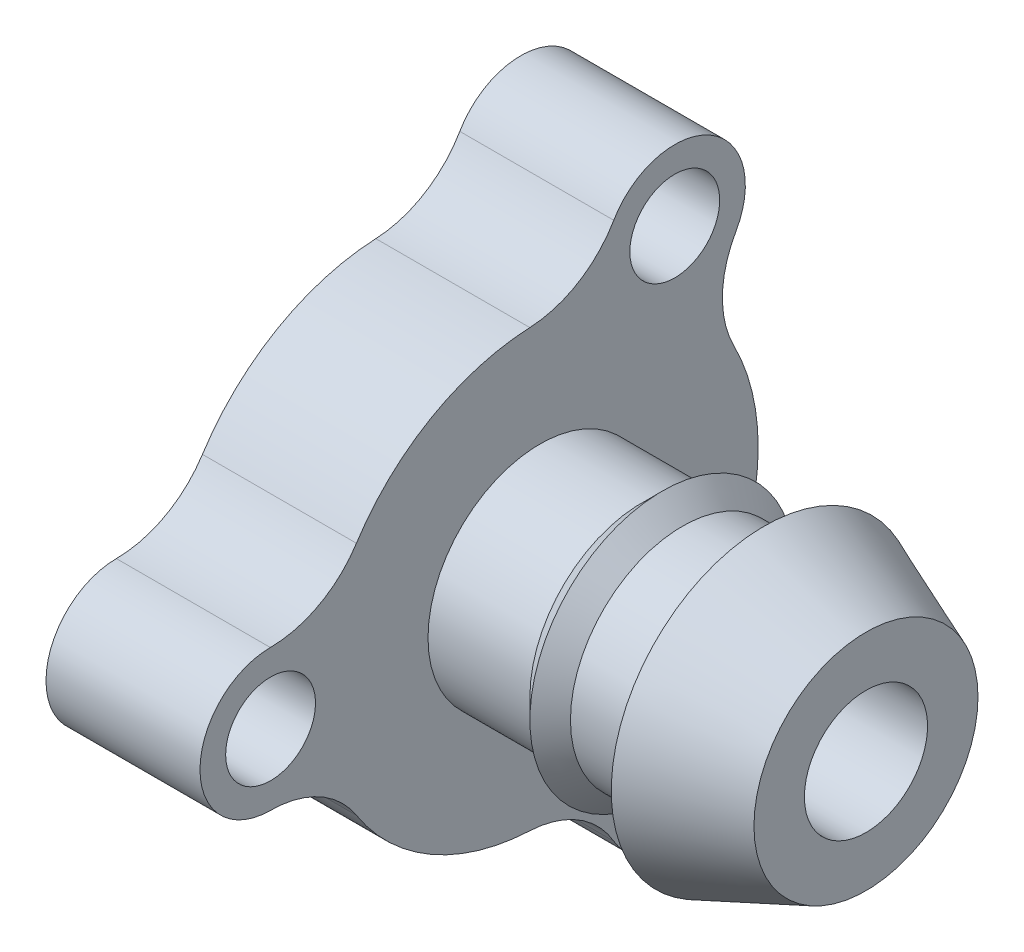
ISO-10303-21;
HEADER;
FILE_DESCRIPTION(('STEP AP214'),'2;1');
FILE_NAME('part.step','',(''),(''),'','','');
FILE_SCHEMA(('AUTOMOTIVE_DESIGN { 1 0 10303 214 1 1 1 1 }'));
ENDSEC;
DATA;
#1=APPLICATION_CONTEXT('core data for automotive mechanical design processes');
#2=APPLICATION_PROTOCOL_DEFINITION('international standard','automotive_design',2000,#1);
#3=PRODUCT_CONTEXT('',#1,'mechanical');
#4=PRODUCT('Part','Part','',(#3));
#5=PRODUCT_RELATED_PRODUCT_CATEGORY('part','',(#4));
#6=PRODUCT_DEFINITION_FORMATION('','',#4);
#7=PRODUCT_DEFINITION_CONTEXT('part definition',#1,'design');
#8=PRODUCT_DEFINITION('design','',#6,#7);
#9=PRODUCT_DEFINITION_SHAPE('','',#8);
#10=(LENGTH_UNIT() NAMED_UNIT(*) SI_UNIT(.MILLI.,.METRE.));
#11=(NAMED_UNIT(*) PLANE_ANGLE_UNIT() SI_UNIT($,.RADIAN.));
#12=(NAMED_UNIT(*) SI_UNIT($,.STERADIAN.) SOLID_ANGLE_UNIT());
#13=UNCERTAINTY_MEASURE_WITH_UNIT(LENGTH_MEASURE(1.E-05),#10,'distance_accuracy_value','');
#14=(GEOMETRIC_REPRESENTATION_CONTEXT(3) GLOBAL_UNCERTAINTY_ASSIGNED_CONTEXT((#13)) GLOBAL_UNIT_ASSIGNED_CONTEXT((#10,
#11,#12)) REPRESENTATION_CONTEXT('',''));
#15=CARTESIAN_POINT('',(0.,0.,0.));
#16=DIRECTION('',(0.,0.,1.));
#17=DIRECTION('',(1.,0.,0.));
#18=AXIS2_PLACEMENT_3D('',#15,#16,#17);
#19=CARTESIAN_POINT('',(-14.7,0.,0.));
#20=DIRECTION('',(1.,0.,0.));
#21=DIRECTION('',(0.,0.,-1.));
#22=AXIS2_PLACEMENT_3D('',#19,#20,#21);
#23=CYLINDRICAL_SURFACE('',#22,8.5);
#24=CARTESIAN_POINT('',(-12.7,0.,0.));
#25=DIRECTION('',(-1.,0.,0.));
#26=DIRECTION('',(0.,0.,1.));
#27=AXIS2_PLACEMENT_3D('',#24,#25,#26);
#28=CIRCLE('',#27,8.5);
#29=CARTESIAN_POINT('',(-12.7,3.90070100733716,-7.55212100349027));
#30=VERTEX_POINT('',#29);
#31=CARTESIAN_POINT('',(-12.7,-3.90070100733716,-7.55212100349027));
#32=VERTEX_POINT('',#31);
#33=EDGE_CURVE('E222',#30,#32,#28,.T.);
#34=ORIENTED_EDGE('',*,*,#33,.T.);
#35=DIRECTION('',(1.,0.,0.));
#36=VECTOR('',#35,1.);
#37=CARTESIAN_POINT('',(-14.7,-3.90070100733716,-7.55212100349027));
#38=LINE('',#37,#36);
#39=CARTESIAN_POINT('',(-18.7,-3.90070100733716,-7.55212100349027));
#40=VERTEX_POINT('',#39);
#41=EDGE_CURVE('E279',#32,#40,#38,.F.);
#42=ORIENTED_EDGE('',*,*,#41,.T.);
#43=CARTESIAN_POINT('',(-18.7,0.,0.));
#44=DIRECTION('',(-1.,0.,0.));
#45=DIRECTION('',(0.,0.,1.));
#46=AXIS2_PLACEMENT_3D('',#43,#44,#45);
#47=CIRCLE('',#46,8.5);
#48=CARTESIAN_POINT('',(-18.7,3.90070100733716,-7.55212100349027));
#49=VERTEX_POINT('',#48);
#50=EDGE_CURVE('E217',#49,#40,#47,.T.);
#51=ORIENTED_EDGE('',*,*,#50,.F.);
#52=DIRECTION('',(1.,0.,0.));
#53=VECTOR('',#52,1.);
#54=CARTESIAN_POINT('',(-14.7,3.90070100733716,-7.55212100349027));
#55=LINE('',#54,#53);
#56=EDGE_CURVE('E276',#49,#30,#55,.T.);
#57=ORIENTED_EDGE('',*,*,#56,.T.);
#58=EDGE_LOOP('',(#34,#42,#51,#57));
#59=FACE_BOUND('',#58,.T.);
#60=ADVANCED_FACE('F87',(#59),#23,.T.);
#61=CARTESIAN_POINT('',(-12.7,-8.49067914514518,0.397954336823604));
#62=VERTEX_POINT('',#61);
#63=CARTESIAN_POINT('',(-12.7,-4.58997813780802,7.15416666666667));
#64=VERTEX_POINT('',#63);
#65=EDGE_CURVE('E221',#62,#64,#28,.T.);
#66=ORIENTED_EDGE('',*,*,#65,.T.);
#67=DIRECTION('',(1.,0.,0.));
#68=VECTOR('',#67,1.);
#69=CARTESIAN_POINT('',(-14.7,-4.58997813780802,7.15416666666667));
#70=LINE('',#69,#68);
#71=CARTESIAN_POINT('',(-18.7,-4.58997813780802,7.15416666666667));
#72=VERTEX_POINT('',#71);
#73=EDGE_CURVE('E258',#64,#72,#70,.F.);
#74=ORIENTED_EDGE('',*,*,#73,.T.);
#75=CARTESIAN_POINT('',(-18.7,-8.49067914514518,0.397954336823605));
#76=VERTEX_POINT('',#75);
#77=EDGE_CURVE('E216',#76,#72,#47,.T.);
#78=ORIENTED_EDGE('',*,*,#77,.F.);
#79=DIRECTION('',(1.,0.,0.));
#80=VECTOR('',#79,1.);
#81=CARTESIAN_POINT('',(-14.7,-8.49067914514518,0.397954336823605));
#82=LINE('',#81,#80);
#83=EDGE_CURVE('E255',#76,#62,#82,.T.);
#84=ORIENTED_EDGE('',*,*,#83,.T.);
#85=EDGE_LOOP('',(#66,#74,#78,#84));
#86=FACE_BOUND('',#85,.T.);
#87=ADVANCED_FACE('F347',(#86),#23,.T.);
#88=CARTESIAN_POINT('',(-18.7,0.,0.));
#89=DIRECTION('',(-1.,0.,0.));
#90=DIRECTION('',(0.,0.,1.));
#91=AXIS2_PLACEMENT_3D('',#88,#89,#90);
#92=PLANE('',#91);
#93=CARTESIAN_POINT('',(-18.7,0.,10.5));
#94=DIRECTION('',(-1.,0.,0.));
#95=DIRECTION('',(0.,0.,1.));
#96=AXIS2_PLACEMENT_3D('',#93,#94,#95);
#97=CIRCLE('',#96,2.75);
#98=CARTESIAN_POINT('',(-18.7,-2.74998690173683,10.508487654321));
#99=VERTEX_POINT('',#98);
#100=CARTESIAN_POINT('',(-18.7,2.74998690173683,10.508487654321));
#101=VERTEX_POINT('',#100);
#102=EDGE_CURVE('E423',#99,#101,#97,.T.);
#103=ORIENTED_EDGE('',*,*,#102,.T.);
#104=CARTESIAN_POINT('',(-18.7,6.74996784971767,10.5208333333333));
#105=DIRECTION('',(-1.,0.,0.));
#106=DIRECTION('',(0.,0.,1.));
#107=AXIS2_PLACEMENT_3D('',#104,#105,#106);
#108=CIRCLE('',#107,4.);
#109=CARTESIAN_POINT('',(-18.7,4.58997813780802,7.15416666666667));
#110=VERTEX_POINT('',#109);
#111=EDGE_CURVE('E325',#101,#110,#108,.F.);
#112=ORIENTED_EDGE('',*,*,#111,.T.);
#113=CARTESIAN_POINT('',(-18.7,8.49067914514518,0.397954336823602));
#114=VERTEX_POINT('',#113);
#115=EDGE_CURVE('E209',#110,#114,#47,.T.);
#116=ORIENTED_EDGE('',*,*,#115,.T.);
#117=CARTESIAN_POINT('',(-18.7,12.4862928605076,0.58522696591706));
#118=DIRECTION('',(-1.,0.,0.));
#119=DIRECTION('',(0.,0.,1.));
#120=AXIS2_PLACEMENT_3D('',#117,#118,#119);
#121=CIRCLE('',#120,4.);
#122=CARTESIAN_POINT('',(-18.7,10.4756107148655,-2.87268531018194));
#123=VERTEX_POINT('',#122);
#124=EDGE_CURVE('E320',#114,#123,#121,.F.);
#125=ORIENTED_EDGE('',*,*,#124,.T.);
#126=CARTESIAN_POINT('',(-18.7,9.0932667397366,-5.25));
#127=DIRECTION('',(-1.,0.,0.));
#128=DIRECTION('',(0.,0.,1.));
#129=AXIS2_PLACEMENT_3D('',#126,#127,#128);
#130=CIRCLE('',#129,2.75);
#131=CARTESIAN_POINT('',(-18.7,7.72562381312871,-7.63580234413905));
#132=VERTEX_POINT('',#131);
#133=EDGE_CURVE('E201',#123,#132,#130,.T.);
#134=ORIENTED_EDGE('',*,*,#133,.T.);
#135=CARTESIAN_POINT('',(-18.7,5.73632501078994,-11.1060602992504));
#136=DIRECTION('',(-1.,0.,0.));
#137=DIRECTION('',(0.,0.,1.));
#138=AXIS2_PLACEMENT_3D('',#135,#136,#137);
#139=CIRCLE('',#138,4.);
#140=EDGE_CURVE('E314',#132,#49,#139,.F.);
#141=ORIENTED_EDGE('',*,*,#140,.T.);
#142=ORIENTED_EDGE('',*,*,#50,.T.);
#143=CARTESIAN_POINT('',(-18.7,-5.73632501078995,-11.1060602992504));
#144=DIRECTION('',(-1.,0.,0.));
#145=DIRECTION('',(0.,0.,1.));
#146=AXIS2_PLACEMENT_3D('',#143,#144,#145);
#147=CIRCLE('',#146,4.);
#148=CARTESIAN_POINT('',(-18.7,-7.72562381312871,-7.63580234413905));
#149=VERTEX_POINT('',#148);
#150=EDGE_CURVE('E308',#40,#149,#147,.F.);
#151=ORIENTED_EDGE('',*,*,#150,.T.);
#152=CARTESIAN_POINT('',(-18.7,-9.09326673973661,-5.25));
#153=DIRECTION('',(-1.,0.,0.));
#154=DIRECTION('',(0.,0.,1.));
#155=AXIS2_PLACEMENT_3D('',#152,#153,#154);
#156=CIRCLE('',#155,2.75);
#157=CARTESIAN_POINT('',(-18.7,-10.4756107148655,-2.87268531018193));
#158=VERTEX_POINT('',#157);
#159=EDGE_CURVE('E419',#149,#158,#156,.T.);
#160=ORIENTED_EDGE('',*,*,#159,.T.);
#161=CARTESIAN_POINT('',(-18.7,-12.4862928605076,0.585226965917065));
#162=DIRECTION('',(-1.,0.,0.));
#163=DIRECTION('',(0.,0.,1.));
#164=AXIS2_PLACEMENT_3D('',#161,#162,#163);
#165=CIRCLE('',#164,4.);
#166=EDGE_CURVE('E302',#158,#76,#165,.F.);
#167=ORIENTED_EDGE('',*,*,#166,.T.);
#168=ORIENTED_EDGE('',*,*,#77,.T.);
#169=CARTESIAN_POINT('',(-18.7,-6.74996784971767,10.5208333333333));
#170=DIRECTION('',(-1.,0.,0.));
#171=DIRECTION('',(0.,0.,1.));
#172=AXIS2_PLACEMENT_3D('',#169,#170,#171);
#173=CIRCLE('',#172,4.);
#174=EDGE_CURVE('E296',#72,#99,#173,.F.);
#175=ORIENTED_EDGE('',*,*,#174,.T.);
#176=EDGE_LOOP('',(#103,#112,#116,#125,#134,#141,#142,#151,#160,#167,#168,#175));
#177=FACE_BOUND('',#176,.T.);
#178=CARTESIAN_POINT('',(-18.7,0.,0.));
#179=DIRECTION('',(-1.,0.,0.));
#180=DIRECTION('',(0.,0.,1.));
#181=AXIS2_PLACEMENT_3D('',#178,#179,#180);
#182=CIRCLE('',#181,6.97135130214869);
#183=CARTESIAN_POINT('',(-18.7,0.,6.97135130214869));
#184=VERTEX_POINT('',#183);
#185=EDGE_CURVE('E191',#184,#184,#182,.T.);
#186=ORIENTED_EDGE('',*,*,#185,.F.);
#187=EDGE_LOOP('',(#186));
#188=FACE_BOUND('',#187,.T.);
#189=CARTESIAN_POINT('',(-18.7,0.,10.5));
#190=DIRECTION('',(-1.,0.,0.));
#191=DIRECTION('',(0.,0.,1.));
#192=AXIS2_PLACEMENT_3D('',#189,#190,#191);
#193=CIRCLE('',#192,1.75);
#194=CARTESIAN_POINT('',(-18.7,0.,12.25));
#195=VERTEX_POINT('',#194);
#196=EDGE_CURVE('E418',#195,#195,#193,.T.);
#197=ORIENTED_EDGE('',*,*,#196,.F.);
#198=EDGE_LOOP('',(#197));
#199=FACE_BOUND('',#198,.T.);
#200=CARTESIAN_POINT('',(-18.7,-9.09326673973661,-5.25));
#201=DIRECTION('',(-1.,0.,0.));
#202=DIRECTION('',(0.,0.,1.));
#203=AXIS2_PLACEMENT_3D('',#200,#201,#202);
#204=CIRCLE('',#203,1.75);
#205=CARTESIAN_POINT('',(-18.7,-9.09326673973661,-3.5));
#206=VERTEX_POINT('',#205);
#207=EDGE_CURVE('E406',#206,#206,#204,.T.);
#208=ORIENTED_EDGE('',*,*,#207,.F.);
#209=EDGE_LOOP('',(#208));
#210=FACE_BOUND('',#209,.T.);
#211=CARTESIAN_POINT('',(-18.7,9.0932667397366,-5.25));
#212=DIRECTION('',(-1.,0.,0.));
#213=DIRECTION('',(0.,0.,1.));
#214=AXIS2_PLACEMENT_3D('',#211,#212,#213);
#215=CIRCLE('',#214,1.75);
#216=CARTESIAN_POINT('',(-18.7,9.0932667397366,-3.5));
#217=VERTEX_POINT('',#216);
#218=EDGE_CURVE('E386',#217,#217,#215,.T.);
#219=ORIENTED_EDGE('',*,*,#218,.F.);
#220=EDGE_LOOP('',(#219));
#221=FACE_BOUND('',#220,.T.);
#222=ADVANCED_FACE('F355',(#177,#188,#199,#210,#221),#92,.T.);
#223=CARTESIAN_POINT('',(-18.7,0.,0.));
#224=DIRECTION('',(-1.,0.,0.));
#225=DIRECTION('',(0.,0.,1.));
#226=AXIS2_PLACEMENT_3D('',#223,#224,#225);
#227=CIRCLE('',#226,4.365);
#228=CARTESIAN_POINT('',(-18.7,0.,4.365));
#229=VERTEX_POINT('',#228);
#230=EDGE_CURVE('E205',#229,#229,#227,.T.);
#231=ORIENTED_EDGE('',*,*,#230,.F.);
#232=EDGE_LOOP('',(#231));
#233=FACE_BOUND('',#232,.T.);
#234=CARTESIAN_POINT('',(-18.7,0.,0.));
#235=DIRECTION('',(1.,0.,0.));
#236=DIRECTION('',(0.,0.,-1.));
#237=AXIS2_PLACEMENT_3D('',#234,#235,#236);
#238=CIRCLE('',#237,5.19335130214869);
#239=CARTESIAN_POINT('',(-18.7,0.,5.19335130214869));
#240=VERTEX_POINT('',#239);
#241=EDGE_CURVE('E189',#240,#240,#238,.T.);
#242=ORIENTED_EDGE('',*,*,#241,.F.);
#243=EDGE_LOOP('',(#242));
#244=FACE_BOUND('',#243,.T.);
#245=ADVANCED_FACE('F444',(#233,#244),#92,.T.);
#246=CARTESIAN_POINT('',(0.,0.,0.));
#247=DIRECTION('',(1.,0.,0.));
#248=DIRECTION('',(0.,0.,-1.));
#249=AXIS2_PLACEMENT_3D('',#246,#247,#248);
#250=PLANE('',#249);
#251=CARTESIAN_POINT('',(0.,0.,0.));
#252=DIRECTION('',(-1.,0.,0.));
#253=DIRECTION('',(0.,0.,1.));
#254=AXIS2_PLACEMENT_3D('',#251,#252,#253);
#255=CIRCLE('',#254,2.4);
#256=CARTESIAN_POINT('',(0.,0.,2.4));
#257=VERTEX_POINT('',#256);
#258=EDGE_CURVE('E193',#257,#257,#255,.T.);
#259=ORIENTED_EDGE('',*,*,#258,.T.);
#260=EDGE_LOOP('',(#259));
#261=FACE_BOUND('',#260,.T.);
#262=CARTESIAN_POINT('',(0.,0.,0.));
#263=DIRECTION('',(1.,0.,0.));
#264=DIRECTION('',(0.,0.,-1.));
#265=AXIS2_PLACEMENT_3D('',#262,#263,#264);
#266=CIRCLE('',#265,4.365);
#267=CARTESIAN_POINT('',(0.,0.,-4.365));
#268=VERTEX_POINT('',#267);
#269=EDGE_CURVE('E247',#268,#268,#266,.T.);
#270=ORIENTED_EDGE('',*,*,#269,.T.);
#271=EDGE_LOOP('',(#270));
#272=FACE_BOUND('',#271,.T.);
#273=ADVANCED_FACE('F622',(#261,#272),#250,.T.);
#274=CARTESIAN_POINT('',(0.,0.,0.));
#275=DIRECTION('',(-1.,0.,0.));
#276=DIRECTION('',(0.,0.,1.));
#277=AXIS2_PLACEMENT_3D('',#274,#275,#276);
#278=CONICAL_SURFACE('',#277,4.365,0.380940593324763);
#279=CARTESIAN_POINT('',(-3.97,0.,0.));
#280=DIRECTION('',(1.,0.,0.));
#281=DIRECTION('',(0.,0.,-1.));
#282=AXIS2_PLACEMENT_3D('',#279,#280,#281);
#283=CIRCLE('',#282,5.955);
#284=CARTESIAN_POINT('',(-3.97,0.,-5.955));
#285=VERTEX_POINT('',#284);
#286=EDGE_CURVE('E243',#285,#285,#283,.T.);
#287=ORIENTED_EDGE('',*,*,#286,.T.);
#288=EDGE_LOOP('',(#287));
#289=FACE_BOUND('',#288,.T.);
#290=ORIENTED_EDGE('',*,*,#269,.F.);
#291=EDGE_LOOP('',(#290));
#292=FACE_BOUND('',#291,.T.);
#293=ADVANCED_FACE('F624',(#289,#292),#278,.T.);
#294=CARTESIAN_POINT('',(-3.97,0.,-5.955));
#295=DIRECTION('',(-1.,0.,0.));
#296=DIRECTION('',(0.,0.,1.));
#297=AXIS2_PLACEMENT_3D('',#294,#295,#296);
#298=PLANE('',#297);
#299=CARTESIAN_POINT('',(-3.97,0.,0.));
#300=DIRECTION('',(1.,0.,0.));
#301=DIRECTION('',(0.,0.,-1.));
#302=AXIS2_PLACEMENT_3D('',#299,#300,#301);
#303=CIRCLE('',#302,4.365);
#304=CARTESIAN_POINT('',(-3.97,0.,-4.365));
#305=VERTEX_POINT('',#304);
#306=EDGE_CURVE('E239',#305,#305,#303,.T.);
#307=ORIENTED_EDGE('',*,*,#306,.T.);
#308=EDGE_LOOP('',(#307));
#309=FACE_BOUND('',#308,.T.);
#310=ORIENTED_EDGE('',*,*,#286,.F.);
#311=EDGE_LOOP('',(#310));
#312=FACE_BOUND('',#311,.T.);
#313=ADVANCED_FACE('F628',(#309,#312),#298,.T.);
#314=CARTESIAN_POINT('',(0.,0.,0.));
#315=DIRECTION('',(1.,0.,0.));
#316=DIRECTION('',(0.,0.,-1.));
#317=AXIS2_PLACEMENT_3D('',#314,#315,#316);
#318=CYLINDRICAL_SURFACE('',#317,4.365);
#319=CARTESIAN_POINT('',(-7.15,0.,0.));
#320=DIRECTION('',(1.,0.,0.));
#321=DIRECTION('',(0.,0.,-1.));
#322=AXIS2_PLACEMENT_3D('',#319,#320,#321);
#323=CIRCLE('',#322,4.365);
#324=CARTESIAN_POINT('',(-7.15,0.,-4.365));
#325=VERTEX_POINT('',#324);
#326=EDGE_CURVE('E235',#325,#325,#323,.T.);
#327=ORIENTED_EDGE('',*,*,#326,.T.);
#328=EDGE_LOOP('',(#327));
#329=FACE_BOUND('',#328,.T.);
#330=ORIENTED_EDGE('',*,*,#306,.F.);
#331=EDGE_LOOP('',(#330));
#332=FACE_BOUND('',#331,.T.);
#333=ADVANCED_FACE('F632',(#329,#332),#318,.T.);
#334=CARTESIAN_POINT('',(-7.15,0.,0.));
#335=DIRECTION('',(-1.,0.,0.));
#336=DIRECTION('',(0.,0.,1.));
#337=AXIS2_PLACEMENT_3D('',#334,#335,#336);
#338=CONICAL_SURFACE('',#337,4.365,0.785398163397448);
#339=CARTESIAN_POINT('',(-7.94,0.,0.));
#340=DIRECTION('',(1.,0.,0.));
#341=DIRECTION('',(0.,0.,-1.));
#342=AXIS2_PLACEMENT_3D('',#339,#340,#341);
#343=CIRCLE('',#342,5.155);
#344=CARTESIAN_POINT('',(-7.94,0.,-5.155));
#345=VERTEX_POINT('',#344);
#346=EDGE_CURVE('E231',#345,#345,#343,.T.);
#347=ORIENTED_EDGE('',*,*,#346,.T.);
#348=EDGE_LOOP('',(#347));
#349=FACE_BOUND('',#348,.T.);
#350=ORIENTED_EDGE('',*,*,#326,.F.);
#351=EDGE_LOOP('',(#350));
#352=FACE_BOUND('',#351,.T.);
#353=ADVANCED_FACE('F636',(#349,#352),#338,.T.);
#354=CARTESIAN_POINT('',(-7.94,0.,0.));
#355=DIRECTION('',(1.,0.,0.));
#356=DIRECTION('',(0.,0.,-1.));
#357=AXIS2_PLACEMENT_3D('',#354,#355,#356);
#358=CONICAL_SURFACE('',#357,5.155,0.785398163397449);
#359=CARTESIAN_POINT('',(-8.73,0.,0.));
#360=DIRECTION('',(1.,0.,0.));
#361=DIRECTION('',(0.,0.,-1.));
#362=AXIS2_PLACEMENT_3D('',#359,#360,#361);
#363=CIRCLE('',#362,4.365);
#364=CARTESIAN_POINT('',(-8.73,0.,-4.365));
#365=VERTEX_POINT('',#364);
#366=EDGE_CURVE('E227',#365,#365,#363,.T.);
#367=ORIENTED_EDGE('',*,*,#366,.T.);
#368=EDGE_LOOP('',(#367));
#369=FACE_BOUND('',#368,.T.);
#370=ORIENTED_EDGE('',*,*,#346,.F.);
#371=EDGE_LOOP('',(#370));
#372=FACE_BOUND('',#371,.T.);
#373=ADVANCED_FACE('F370',(#369,#372),#358,.T.);
#374=CARTESIAN_POINT('',(0.,0.,0.));
#375=DIRECTION('',(1.,0.,0.));
#376=DIRECTION('',(0.,0.,-1.));
#377=AXIS2_PLACEMENT_3D('',#374,#375,#376);
#378=CYLINDRICAL_SURFACE('',#377,4.365);
#379=CARTESIAN_POINT('',(-12.7,0.,0.));
#380=DIRECTION('',(-1.,0.,0.));
#381=DIRECTION('',(0.,0.,1.));
#382=AXIS2_PLACEMENT_3D('',#379,#380,#381);
#383=CIRCLE('',#382,4.365);
#384=CARTESIAN_POINT('',(-12.7,0.,4.365));
#385=VERTEX_POINT('',#384);
#386=EDGE_CURVE('E223',#385,#385,#383,.F.);
#387=ORIENTED_EDGE('',*,*,#386,.T.);
#388=EDGE_LOOP('',(#387));
#389=FACE_BOUND('',#388,.T.);
#390=ORIENTED_EDGE('',*,*,#366,.F.);
#391=EDGE_LOOP('',(#390));
#392=FACE_BOUND('',#391,.T.);
#393=ADVANCED_FACE('F362',(#389,#392),#378,.T.);
#394=CARTESIAN_POINT('',(-12.7,4.58997813780802,7.15416666666667));
#395=VERTEX_POINT('',#394);
#396=CARTESIAN_POINT('',(-12.7,8.49067914514518,0.397954336823601));
#397=VERTEX_POINT('',#396);
#398=EDGE_CURVE('E218',#395,#397,#28,.T.);
#399=ORIENTED_EDGE('',*,*,#398,.T.);
#400=DIRECTION('',(1.,0.,0.));
#401=VECTOR('',#400,1.);
#402=CARTESIAN_POINT('',(-14.7,8.49067914514518,0.397954336823601));
#403=LINE('',#402,#401);
#404=EDGE_CURVE('E292',#397,#114,#403,.F.);
#405=ORIENTED_EDGE('',*,*,#404,.T.);
#406=ORIENTED_EDGE('',*,*,#115,.F.);
#407=DIRECTION('',(1.,0.,0.));
#408=VECTOR('',#407,1.);
#409=CARTESIAN_POINT('',(-14.7,4.58997813780802,7.15416666666667));
#410=LINE('',#409,#408);
#411=EDGE_CURVE('E111',#110,#395,#410,.T.);
#412=ORIENTED_EDGE('',*,*,#411,.T.);
#413=EDGE_LOOP('',(#399,#405,#406,#412));
#414=FACE_BOUND('',#413,.T.);
#415=ADVANCED_FACE('F350',(#414),#23,.T.);
#416=CARTESIAN_POINT('',(-12.7,0.,0.));
#417=DIRECTION('',(-1.,0.,0.));
#418=DIRECTION('',(0.,0.,1.));
#419=AXIS2_PLACEMENT_3D('',#416,#417,#418);
#420=PLANE('',#419);
#421=ORIENTED_EDGE('',*,*,#386,.F.);
#422=EDGE_LOOP('',(#421));
#423=FACE_BOUND('',#422,.T.);
#424=CARTESIAN_POINT('',(-12.7,9.0932667397366,-5.25));
#425=DIRECTION('',(-1.,0.,0.));
#426=DIRECTION('',(0.,0.,1.));
#427=AXIS2_PLACEMENT_3D('',#424,#425,#426);
#428=CIRCLE('',#427,1.75);
#429=CARTESIAN_POINT('',(-12.7,9.0932667397366,-3.5));
#430=VERTEX_POINT('',#429);
#431=EDGE_CURVE('E390',#430,#430,#428,.F.);
#432=ORIENTED_EDGE('',*,*,#431,.F.);
#433=EDGE_LOOP('',(#432));
#434=FACE_BOUND('',#433,.T.);
#435=ORIENTED_EDGE('',*,*,#33,.F.);
#436=CARTESIAN_POINT('',(-12.7,5.73632501078994,-11.1060602992504));
#437=DIRECTION('',(-1.,0.,0.));
#438=DIRECTION('',(0.,0.,1.));
#439=AXIS2_PLACEMENT_3D('',#436,#437,#438);
#440=CIRCLE('',#439,4.);
#441=CARTESIAN_POINT('',(-12.7,7.72562381312871,-7.63580234413905));
#442=VERTEX_POINT('',#441);
#443=EDGE_CURVE('E317',#30,#442,#440,.T.);
#444=ORIENTED_EDGE('',*,*,#443,.T.);
#445=CARTESIAN_POINT('',(-12.7,9.0932667397366,-5.25));
#446=DIRECTION('',(-1.,0.,0.));
#447=DIRECTION('',(0.,0.,1.));
#448=AXIS2_PLACEMENT_3D('',#445,#446,#447);
#449=CIRCLE('',#448,2.75);
#450=CARTESIAN_POINT('',(-12.7,10.4756107148655,-2.87268531018194));
#451=VERTEX_POINT('',#450);
#452=EDGE_CURVE('E194',#442,#451,#449,.F.);
#453=ORIENTED_EDGE('',*,*,#452,.T.);
#454=CARTESIAN_POINT('',(-12.7,12.4862928605076,0.58522696591706));
#455=DIRECTION('',(-1.,0.,0.));
#456=DIRECTION('',(0.,0.,1.));
#457=AXIS2_PLACEMENT_3D('',#454,#455,#456);
#458=CIRCLE('',#457,4.);
#459=EDGE_CURVE('E104',#451,#397,#458,.T.);
#460=ORIENTED_EDGE('',*,*,#459,.T.);
#461=ORIENTED_EDGE('',*,*,#398,.F.);
#462=CARTESIAN_POINT('',(-12.7,6.74996784971767,10.5208333333333));
#463=DIRECTION('',(-1.,0.,0.));
#464=DIRECTION('',(0.,0.,1.));
#465=AXIS2_PLACEMENT_3D('',#462,#463,#464);
#466=CIRCLE('',#465,4.);
#467=CARTESIAN_POINT('',(-12.7,2.74998690173683,10.508487654321));
#468=VERTEX_POINT('',#467);
#469=EDGE_CURVE('E328',#395,#468,#466,.T.);
#470=ORIENTED_EDGE('',*,*,#469,.T.);
#471=CARTESIAN_POINT('',(-12.7,0.,10.5));
#472=DIRECTION('',(-1.,0.,0.));
#473=DIRECTION('',(0.,0.,1.));
#474=AXIS2_PLACEMENT_3D('',#471,#472,#473);
#475=CIRCLE('',#474,2.75);
#476=CARTESIAN_POINT('',(-12.7,-2.74998690173683,10.508487654321));
#477=VERTEX_POINT('',#476);
#478=EDGE_CURVE('E401',#468,#477,#475,.F.);
#479=ORIENTED_EDGE('',*,*,#478,.T.);
#480=CARTESIAN_POINT('',(-12.7,-6.74996784971767,10.5208333333333));
#481=DIRECTION('',(-1.,0.,0.));
#482=DIRECTION('',(0.,0.,1.));
#483=AXIS2_PLACEMENT_3D('',#480,#481,#482);
#484=CIRCLE('',#483,4.);
#485=EDGE_CURVE('E299',#477,#64,#484,.T.);
#486=ORIENTED_EDGE('',*,*,#485,.T.);
#487=ORIENTED_EDGE('',*,*,#65,.F.);
#488=CARTESIAN_POINT('',(-12.7,-12.4862928605076,0.585226965917064));
#489=DIRECTION('',(-1.,0.,0.));
#490=DIRECTION('',(0.,0.,1.));
#491=AXIS2_PLACEMENT_3D('',#488,#489,#490);
#492=CIRCLE('',#491,4.);
#493=CARTESIAN_POINT('',(-12.7,-10.4756107148655,-2.87268531018194));
#494=VERTEX_POINT('',#493);
#495=EDGE_CURVE('E305',#62,#494,#492,.T.);
#496=ORIENTED_EDGE('',*,*,#495,.T.);
#497=CARTESIAN_POINT('',(-12.7,-9.09326673973661,-5.25));
#498=DIRECTION('',(-1.,0.,0.));
#499=DIRECTION('',(0.,0.,1.));
#500=AXIS2_PLACEMENT_3D('',#497,#498,#499);
#501=CIRCLE('',#500,2.75);
#502=CARTESIAN_POINT('',(-12.7,-7.72562381312871,-7.63580234413905));
#503=VERTEX_POINT('',#502);
#504=EDGE_CURVE('E393',#494,#503,#501,.F.);
#505=ORIENTED_EDGE('',*,*,#504,.T.);
#506=CARTESIAN_POINT('',(-12.7,-5.73632501078995,-11.1060602992504));
#507=DIRECTION('',(-1.,0.,0.));
#508=DIRECTION('',(0.,0.,1.));
#509=AXIS2_PLACEMENT_3D('',#506,#507,#508);
#510=CIRCLE('',#509,4.);
#511=EDGE_CURVE('E311',#503,#32,#510,.T.);
#512=ORIENTED_EDGE('',*,*,#511,.T.);
#513=EDGE_LOOP('',(#435,#444,#453,#460,#461,#470,#479,#486,#487,#496,#505,#512));
#514=FACE_BOUND('',#513,.T.);
#515=CARTESIAN_POINT('',(-12.7,0.,10.5));
#516=DIRECTION('',(-1.,0.,0.));
#517=DIRECTION('',(0.,0.,1.));
#518=AXIS2_PLACEMENT_3D('',#515,#516,#517);
#519=CIRCLE('',#518,1.75);
#520=CARTESIAN_POINT('',(-12.7,0.,12.25));
#521=VERTEX_POINT('',#520);
#522=EDGE_CURVE('E414',#521,#521,#519,.F.);
#523=ORIENTED_EDGE('',*,*,#522,.F.);
#524=EDGE_LOOP('',(#523));
#525=FACE_BOUND('',#524,.T.);
#526=CARTESIAN_POINT('',(-12.7,-9.09326673973661,-5.25));
#527=DIRECTION('',(-1.,0.,0.));
#528=DIRECTION('',(0.,0.,1.));
#529=AXIS2_PLACEMENT_3D('',#526,#527,#528);
#530=CIRCLE('',#529,1.75);
#531=CARTESIAN_POINT('',(-12.7,-9.09326673973661,-3.5));
#532=VERTEX_POINT('',#531);
#533=EDGE_CURVE('E411',#532,#532,#530,.F.);
#534=ORIENTED_EDGE('',*,*,#533,.F.);
#535=EDGE_LOOP('',(#534));
#536=FACE_BOUND('',#535,.T.);
#537=ADVANCED_FACE('F361',(#423,#434,#514,#525,#536),#420,.F.);
#538=CARTESIAN_POINT('',(-18.7,0.,0.));
#539=DIRECTION('',(1.,0.,0.));
#540=DIRECTION('',(0.,0.,-1.));
#541=AXIS2_PLACEMENT_3D('',#538,#539,#540);
#542=CYLINDRICAL_SURFACE('',#541,4.365);
#543=ORIENTED_EDGE('',*,*,#230,.T.);
#544=EDGE_LOOP('',(#543));
#545=FACE_BOUND('',#544,.T.);
#546=CARTESIAN_POINT('',(-14.7,0.,0.));
#547=DIRECTION('',(-1.,0.,0.));
#548=DIRECTION('',(0.,0.,1.));
#549=AXIS2_PLACEMENT_3D('',#546,#547,#548);
#550=CIRCLE('',#549,4.365);
#551=CARTESIAN_POINT('',(-14.7,0.,4.365));
#552=VERTEX_POINT('',#551);
#553=EDGE_CURVE('E199',#552,#552,#550,.T.);
#554=ORIENTED_EDGE('',*,*,#553,.F.);
#555=EDGE_LOOP('',(#554));
#556=FACE_BOUND('',#555,.T.);
#557=ADVANCED_FACE('F367',(#545,#556),#542,.F.);
#558=CARTESIAN_POINT('',(-14.7,0.,0.));
#559=DIRECTION('',(1.,0.,0.));
#560=DIRECTION('',(0.,0.,-1.));
#561=AXIS2_PLACEMENT_3D('',#558,#559,#560);
#562=CYLINDRICAL_SURFACE('',#561,2.4);
#563=CARTESIAN_POINT('',(-13.7,0.,0.));
#564=DIRECTION('',(-1.,0.,0.));
#565=DIRECTION('',(0.,0.,1.));
#566=AXIS2_PLACEMENT_3D('',#563,#564,#565);
#567=CIRCLE('',#566,2.4);
#568=CARTESIAN_POINT('',(-13.7,0.,2.4));
#569=VERTEX_POINT('',#568);
#570=EDGE_CURVE('E97',#569,#569,#567,.T.);
#571=ORIENTED_EDGE('',*,*,#570,.T.);
#572=EDGE_LOOP('',(#571));
#573=FACE_BOUND('',#572,.T.);
#574=ORIENTED_EDGE('',*,*,#258,.F.);
#575=EDGE_LOOP('',(#574));
#576=FACE_BOUND('',#575,.T.);
#577=ADVANCED_FACE('F334',(#573,#576),#562,.F.);
#578=CARTESIAN_POINT('',(-14.7,0.,0.));
#579=DIRECTION('',(-1.,0.,0.));
#580=DIRECTION('',(0.,0.,1.));
#581=AXIS2_PLACEMENT_3D('',#578,#579,#580);
#582=PLANE('',#581);
#583=CARTESIAN_POINT('',(-14.7,0.,0.));
#584=DIRECTION('',(-1.,0.,0.));
#585=DIRECTION('',(0.,0.,1.));
#586=AXIS2_PLACEMENT_3D('',#583,#584,#585);
#587=CIRCLE('',#586,3.40000000000001);
#588=CARTESIAN_POINT('',(-14.7,0.,3.40000000000001));
#589=VERTEX_POINT('',#588);
#590=EDGE_CURVE('E12',#589,#589,#587,.F.);
#591=ORIENTED_EDGE('',*,*,#590,.T.);
#592=EDGE_LOOP('',(#591));
#593=FACE_BOUND('',#592,.T.);
#594=ORIENTED_EDGE('',*,*,#553,.T.);
#595=EDGE_LOOP('',(#594));
#596=FACE_BOUND('',#595,.T.);
#597=ADVANCED_FACE('F457',(#593,#596),#582,.T.);
#598=CARTESIAN_POINT('',(-18.7,0.,0.));
#599=DIRECTION('',(-1.,0.,0.));
#600=DIRECTION('',(0.,0.,1.));
#601=AXIS2_PLACEMENT_3D('',#598,#599,#600);
#602=TOROIDAL_SURFACE('',#601,6.08235130214869,0.889000000000001);
#603=ORIENTED_EDGE('',*,*,#185,.T.);
#604=CARTESIAN_POINT('',(-18.7,0.,6.08235130214869));
#605=DIRECTION('',(0.,1.,0.));
#606=DIRECTION('',(-1.,0.,0.));
#607=AXIS2_PLACEMENT_3D('',#604,#605,#606);
#608=CIRCLE('',#607,0.889000000000001);
#609=EDGE_CURVE('E186',#184,#240,#608,.T.);
#610=ORIENTED_EDGE('',*,*,#609,.T.);
#611=ORIENTED_EDGE('',*,*,#241,.T.);
#612=ORIENTED_EDGE('',*,*,#609,.F.);
#613=EDGE_LOOP('',(#603,#610,#611,#612));
#614=FACE_BOUND('',#613,.T.);
#615=ADVANCED_FACE('F187',(#614),#602,.F.);
#616=CARTESIAN_POINT('',(17.081051050023,9.0932667397366,-5.25000000000001));
#617=DIRECTION('',(-1.,0.,0.));
#618=DIRECTION('',(0.,0.,1.));
#619=AXIS2_PLACEMENT_3D('',#616,#617,#618);
#620=CYLINDRICAL_SURFACE('',#619,1.75);
#621=ORIENTED_EDGE('',*,*,#431,.T.);
#622=EDGE_LOOP('',(#621));
#623=FACE_BOUND('',#622,.T.);
#624=ORIENTED_EDGE('',*,*,#218,.T.);
#625=EDGE_LOOP('',(#624));
#626=FACE_BOUND('',#625,.T.);
#627=ADVANCED_FACE('F448',(#623,#626),#620,.F.);
#628=CARTESIAN_POINT('',(17.081051050023,9.0932667397366,-5.25000000000001));
#629=DIRECTION('',(-1.,0.,0.));
#630=DIRECTION('',(0.,0.,1.));
#631=AXIS2_PLACEMENT_3D('',#628,#629,#630);
#632=CYLINDRICAL_SURFACE('',#631,2.75);
#633=ORIENTED_EDGE('',*,*,#452,.F.);
#634=DIRECTION('',(-1.,0.,0.));
#635=VECTOR('',#634,1.);
#636=CARTESIAN_POINT('',(17.081051050023,7.7256238131287,-7.63580234413906));
#637=LINE('',#636,#635);
#638=EDGE_CURVE('E286',#442,#132,#637,.T.);
#639=ORIENTED_EDGE('',*,*,#638,.T.);
#640=ORIENTED_EDGE('',*,*,#133,.F.);
#641=DIRECTION('',(-1.,0.,0.));
#642=VECTOR('',#641,1.);
#643=CARTESIAN_POINT('',(17.081051050023,10.4756107148655,-2.87268531018194));
#644=LINE('',#643,#642);
#645=EDGE_CURVE('E283',#123,#451,#644,.F.);
#646=ORIENTED_EDGE('',*,*,#645,.T.);
#647=EDGE_LOOP('',(#633,#639,#640,#646));
#648=FACE_BOUND('',#647,.T.);
#649=ADVANCED_FACE('F383',(#648),#632,.T.);
#650=CARTESIAN_POINT('',(17.081051050023,0.,10.5));
#651=DIRECTION('',(-1.,0.,0.));
#652=DIRECTION('',(0.,0.,1.));
#653=AXIS2_PLACEMENT_3D('',#650,#651,#652);
#654=CYLINDRICAL_SURFACE('',#653,1.75);
#655=ORIENTED_EDGE('',*,*,#522,.T.);
#656=EDGE_LOOP('',(#655));
#657=FACE_BOUND('',#656,.T.);
#658=ORIENTED_EDGE('',*,*,#196,.T.);
#659=EDGE_LOOP('',(#658));
#660=FACE_BOUND('',#659,.T.);
#661=ADVANCED_FACE('F455',(#657,#660),#654,.F.);
#662=CARTESIAN_POINT('',(17.081051050023,0.,10.5));
#663=DIRECTION('',(-1.,0.,0.));
#664=DIRECTION('',(0.,0.,1.));
#665=AXIS2_PLACEMENT_3D('',#662,#663,#664);
#666=CYLINDRICAL_SURFACE('',#665,2.75);
#667=ORIENTED_EDGE('',*,*,#102,.F.);
#668=DIRECTION('',(-1.,0.,0.));
#669=VECTOR('',#668,1.);
#670=CARTESIAN_POINT('',(17.081051050023,-2.74998690173683,10.508487654321));
#671=LINE('',#670,#669);
#672=EDGE_CURVE('E266',#99,#477,#671,.F.);
#673=ORIENTED_EDGE('',*,*,#672,.T.);
#674=ORIENTED_EDGE('',*,*,#478,.F.);
#675=DIRECTION('',(-1.,0.,0.));
#676=VECTOR('',#675,1.);
#677=CARTESIAN_POINT('',(17.081051050023,2.74998690173683,10.508487654321));
#678=LINE('',#677,#676);
#679=EDGE_CURVE('E262',#468,#101,#678,.T.);
#680=ORIENTED_EDGE('',*,*,#679,.T.);
#681=EDGE_LOOP('',(#667,#673,#674,#680));
#682=FACE_BOUND('',#681,.T.);
#683=ADVANCED_FACE('F501',(#682),#666,.T.);
#684=CARTESIAN_POINT('',(17.081051050023,-9.09326673973661,-5.25));
#685=DIRECTION('',(-1.,0.,0.));
#686=DIRECTION('',(0.,0.,1.));
#687=AXIS2_PLACEMENT_3D('',#684,#685,#686);
#688=CYLINDRICAL_SURFACE('',#687,2.75);
#689=ORIENTED_EDGE('',*,*,#504,.F.);
#690=DIRECTION('',(-1.,0.,0.));
#691=VECTOR('',#690,1.);
#692=CARTESIAN_POINT('',(17.081051050023,-10.4756107148655,-2.87268531018194));
#693=LINE('',#692,#691);
#694=EDGE_CURVE('E272',#494,#158,#693,.T.);
#695=ORIENTED_EDGE('',*,*,#694,.T.);
#696=ORIENTED_EDGE('',*,*,#159,.F.);
#697=DIRECTION('',(-1.,0.,0.));
#698=VECTOR('',#697,1.);
#699=CARTESIAN_POINT('',(17.081051050023,-7.72562381312871,-7.63580234413905));
#700=LINE('',#699,#698);
#701=EDGE_CURVE('E269',#149,#503,#700,.F.);
#702=ORIENTED_EDGE('',*,*,#701,.T.);
#703=EDGE_LOOP('',(#689,#695,#696,#702));
#704=FACE_BOUND('',#703,.T.);
#705=ADVANCED_FACE('F438',(#704),#688,.T.);
#706=CARTESIAN_POINT('',(17.081051050023,-9.09326673973661,-5.25));
#707=DIRECTION('',(-1.,0.,0.));
#708=DIRECTION('',(0.,0.,1.));
#709=AXIS2_PLACEMENT_3D('',#706,#707,#708);
#710=CYLINDRICAL_SURFACE('',#709,1.75);
#711=ORIENTED_EDGE('',*,*,#533,.T.);
#712=EDGE_LOOP('',(#711));
#713=FACE_BOUND('',#712,.T.);
#714=ORIENTED_EDGE('',*,*,#207,.T.);
#715=EDGE_LOOP('',(#714));
#716=FACE_BOUND('',#715,.T.);
#717=ADVANCED_FACE('F433',(#713,#716),#710,.F.);
#718=CARTESIAN_POINT('',(17.081051050023,-6.74996784971767,10.5208333333333));
#719=DIRECTION('',(1.,0.,0.));
#720=DIRECTION('',(0.,0.,-1.));
#721=AXIS2_PLACEMENT_3D('',#718,#719,#720);
#722=CYLINDRICAL_SURFACE('',#721,4.);
#723=ORIENTED_EDGE('',*,*,#485,.F.);
#724=ORIENTED_EDGE('',*,*,#672,.F.);
#725=ORIENTED_EDGE('',*,*,#174,.F.);
#726=ORIENTED_EDGE('',*,*,#73,.F.);
#727=EDGE_LOOP('',(#723,#724,#725,#726));
#728=FACE_BOUND('',#727,.T.);
#729=ADVANCED_FACE('F437',(#728),#722,.F.);
#730=CARTESIAN_POINT('',(-14.7,-12.4862928605076,0.585226965917065));
#731=DIRECTION('',(1.,0.,0.));
#732=DIRECTION('',(0.,0.,-1.));
#733=AXIS2_PLACEMENT_3D('',#730,#731,#732);
#734=CYLINDRICAL_SURFACE('',#733,4.);
#735=ORIENTED_EDGE('',*,*,#495,.F.);
#736=ORIENTED_EDGE('',*,*,#83,.F.);
#737=ORIENTED_EDGE('',*,*,#166,.F.);
#738=ORIENTED_EDGE('',*,*,#694,.F.);
#739=EDGE_LOOP('',(#735,#736,#737,#738));
#740=FACE_BOUND('',#739,.T.);
#741=ADVANCED_FACE('F570',(#740),#734,.F.);
#742=CARTESIAN_POINT('',(17.081051050023,-5.73632501078995,-11.1060602992504));
#743=DIRECTION('',(1.,0.,0.));
#744=DIRECTION('',(0.,0.,-1.));
#745=AXIS2_PLACEMENT_3D('',#742,#743,#744);
#746=CYLINDRICAL_SURFACE('',#745,4.);
#747=ORIENTED_EDGE('',*,*,#511,.F.);
#748=ORIENTED_EDGE('',*,*,#701,.F.);
#749=ORIENTED_EDGE('',*,*,#150,.F.);
#750=ORIENTED_EDGE('',*,*,#41,.F.);
#751=EDGE_LOOP('',(#747,#748,#749,#750));
#752=FACE_BOUND('',#751,.T.);
#753=ADVANCED_FACE('F580',(#752),#746,.F.);
#754=CARTESIAN_POINT('',(-14.7,5.73632501078994,-11.1060602992504));
#755=DIRECTION('',(1.,0.,0.));
#756=DIRECTION('',(0.,0.,-1.));
#757=AXIS2_PLACEMENT_3D('',#754,#755,#756);
#758=CYLINDRICAL_SURFACE('',#757,4.);
#759=ORIENTED_EDGE('',*,*,#443,.F.);
#760=ORIENTED_EDGE('',*,*,#56,.F.);
#761=ORIENTED_EDGE('',*,*,#140,.F.);
#762=ORIENTED_EDGE('',*,*,#638,.F.);
#763=EDGE_LOOP('',(#759,#760,#761,#762));
#764=FACE_BOUND('',#763,.T.);
#765=ADVANCED_FACE('F590',(#764),#758,.F.);
#766=CARTESIAN_POINT('',(17.081051050023,12.4862928605076,0.585226965917056));
#767=DIRECTION('',(1.,0.,0.));
#768=DIRECTION('',(0.,0.,-1.));
#769=AXIS2_PLACEMENT_3D('',#766,#767,#768);
#770=CYLINDRICAL_SURFACE('',#769,4.);
#771=ORIENTED_EDGE('',*,*,#459,.F.);
#772=ORIENTED_EDGE('',*,*,#645,.F.);
#773=ORIENTED_EDGE('',*,*,#124,.F.);
#774=ORIENTED_EDGE('',*,*,#404,.F.);
#775=EDGE_LOOP('',(#771,#772,#773,#774));
#776=FACE_BOUND('',#775,.T.);
#777=ADVANCED_FACE('F343',(#776),#770,.F.);
#778=CARTESIAN_POINT('',(-14.7,6.74996784971767,10.5208333333333));
#779=DIRECTION('',(1.,0.,0.));
#780=DIRECTION('',(0.,0.,-1.));
#781=AXIS2_PLACEMENT_3D('',#778,#779,#780);
#782=CYLINDRICAL_SURFACE('',#781,4.);
#783=ORIENTED_EDGE('',*,*,#469,.F.);
#784=ORIENTED_EDGE('',*,*,#411,.F.);
#785=ORIENTED_EDGE('',*,*,#111,.F.);
#786=ORIENTED_EDGE('',*,*,#679,.F.);
#787=EDGE_LOOP('',(#783,#784,#785,#786));
#788=FACE_BOUND('',#787,.T.);
#789=ADVANCED_FACE('F338',(#788),#782,.F.);
#790=CARTESIAN_POINT('',(-13.7,0.,0.));
#791=DIRECTION('',(-1.,0.,0.));
#792=DIRECTION('',(0.,0.,1.));
#793=AXIS2_PLACEMENT_3D('',#790,#791,#792);
#794=CONICAL_SURFACE('',#793,2.4,0.785398163397451);
#795=ORIENTED_EDGE('',*,*,#590,.F.);
#796=EDGE_LOOP('',(#795));
#797=FACE_BOUND('',#796,.T.);
#798=ORIENTED_EDGE('',*,*,#570,.F.);
#799=EDGE_LOOP('',(#798));
#800=FACE_BOUND('',#799,.T.);
#801=ADVANCED_FACE('F90',(#797,#800),#794,.F.);
#802=CLOSED_SHELL('',(#60,#87,#222,#245,#273,#293,#313,#333,#353,#373,#393,#415,#537,#557,#577,
#597,#615,#627,#649,#661,#683,#705,#717,#729,#741,#753,#765,#777,#789,#801));
#803=MANIFOLD_SOLID_BREP('B2',#802);
#804=ADVANCED_BREP_SHAPE_REPRESENTATION('',(#18,#803),#14);
#805=SHAPE_DEFINITION_REPRESENTATION(#9,#804);
ENDSEC;
END-ISO-10303-21;
